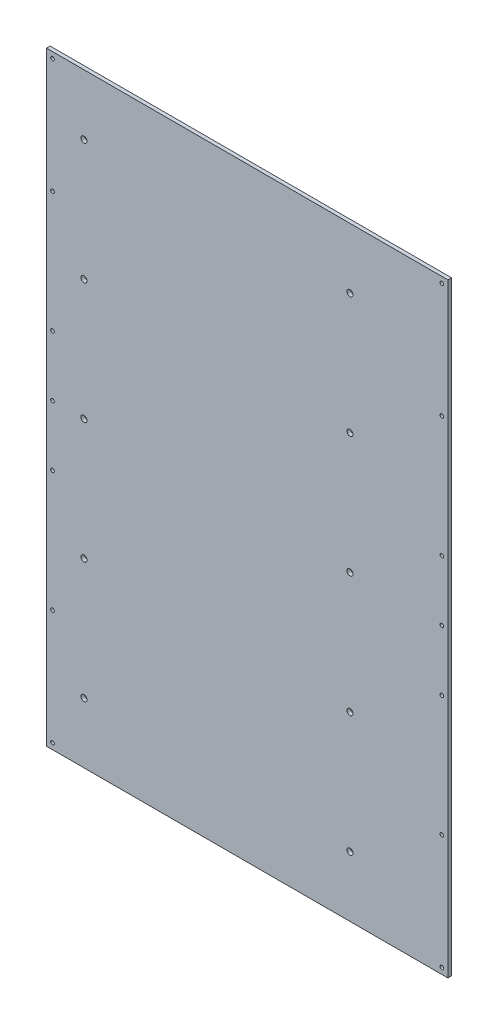
ISO-10303-21;
HEADER;
FILE_DESCRIPTION(('STEP AP214'),'2;1');
FILE_NAME('part.step','',(''),(''),'','','');
FILE_SCHEMA(('AUTOMOTIVE_DESIGN { 1 0 10303 214 1 1 1 1 }'));
ENDSEC;
DATA;
#1=APPLICATION_CONTEXT('core data for automotive mechanical design processes');
#2=APPLICATION_PROTOCOL_DEFINITION('international standard','automotive_design',2000,#1);
#3=PRODUCT_CONTEXT('',#1,'mechanical');
#4=PRODUCT('Part','Part','',(#3));
#5=PRODUCT_RELATED_PRODUCT_CATEGORY('part','',(#4));
#6=PRODUCT_DEFINITION_FORMATION('','',#4);
#7=PRODUCT_DEFINITION_CONTEXT('part definition',#1,'design');
#8=PRODUCT_DEFINITION('design','',#6,#7);
#9=PRODUCT_DEFINITION_SHAPE('','',#8);
#10=(LENGTH_UNIT() NAMED_UNIT(*) SI_UNIT(.MILLI.,.METRE.));
#11=(NAMED_UNIT(*) PLANE_ANGLE_UNIT() SI_UNIT($,.RADIAN.));
#12=(NAMED_UNIT(*) SI_UNIT($,.STERADIAN.) SOLID_ANGLE_UNIT());
#13=UNCERTAINTY_MEASURE_WITH_UNIT(LENGTH_MEASURE(1.E-05),#10,'distance_accuracy_value','');
#14=(GEOMETRIC_REPRESENTATION_CONTEXT(3) GLOBAL_UNCERTAINTY_ASSIGNED_CONTEXT((#13)) GLOBAL_UNIT_ASSIGNED_CONTEXT((#10,
#11,#12)) REPRESENTATION_CONTEXT('',''));
#15=CARTESIAN_POINT('',(0.,0.,0.));
#16=DIRECTION('',(0.,0.,1.));
#17=DIRECTION('',(1.,0.,0.));
#18=AXIS2_PLACEMENT_3D('',#15,#16,#17);
#19=CARTESIAN_POINT('',(0.,0.,3.));
#20=DIRECTION('',(0.,0.,-1.));
#21=DIRECTION('',(-1.,0.,0.));
#22=AXIS2_PLACEMENT_3D('',#19,#20,#21);
#23=PLANE('',#22);
#24=DIRECTION('',(0.,-1.,0.));
#25=VECTOR('',#24,1.);
#26=CARTESIAN_POINT('',(0.,0.,3.));
#27=LINE('',#26,#25);
#28=CARTESIAN_POINT('',(0.,500.,3.));
#29=VERTEX_POINT('',#28);
#30=CARTESIAN_POINT('',(0.,0.,3.));
#31=VERTEX_POINT('',#30);
#32=EDGE_CURVE('E87',#29,#31,#27,.T.);
#33=ORIENTED_EDGE('',*,*,#32,.T.);
#34=DIRECTION('',(1.,0.,0.));
#35=VECTOR('',#34,1.);
#36=CARTESIAN_POINT('',(0.,0.,3.));
#37=LINE('',#36,#35);
#38=CARTESIAN_POINT('',(332.,0.,3.));
#39=VERTEX_POINT('',#38);
#40=EDGE_CURVE('E82',#31,#39,#37,.T.);
#41=ORIENTED_EDGE('',*,*,#40,.T.);
#42=DIRECTION('',(0.,1.,0.));
#43=VECTOR('',#42,1.);
#44=CARTESIAN_POINT('',(332.,0.,3.));
#45=LINE('',#44,#43);
#46=CARTESIAN_POINT('',(332.,500.,3.));
#47=VERTEX_POINT('',#46);
#48=EDGE_CURVE('E85',#39,#47,#45,.T.);
#49=ORIENTED_EDGE('',*,*,#48,.T.);
#50=DIRECTION('',(-1.,0.,0.));
#51=VECTOR('',#50,1.);
#52=CARTESIAN_POINT('',(0.,500.,3.));
#53=LINE('',#52,#51);
#54=EDGE_CURVE('E52',#47,#29,#53,.T.);
#55=ORIENTED_EDGE('',*,*,#54,.T.);
#56=EDGE_LOOP('',(#33,#41,#49,#55));
#57=FACE_BOUND('',#56,.T.);
#58=CARTESIAN_POINT('',(327.,250.,3.));
#59=DIRECTION('',(0.,0.,1.));
#60=DIRECTION('',(1.,0.,0.));
#61=AXIS2_PLACEMENT_3D('',#58,#59,#60);
#62=CIRCLE('',#61,1.49999999999997);
#63=CARTESIAN_POINT('',(328.5,250.,3.));
#64=VERTEX_POINT('',#63);
#65=EDGE_CURVE('E102',#64,#64,#62,.T.);
#66=ORIENTED_EDGE('',*,*,#65,.F.);
#67=EDGE_LOOP('',(#66));
#68=FACE_BOUND('',#67,.T.);
#69=CARTESIAN_POINT('',(327.,300.,3.));
#70=DIRECTION('',(0.,0.,1.));
#71=DIRECTION('',(1.,0.,0.));
#72=AXIS2_PLACEMENT_3D('',#69,#70,#71);
#73=CIRCLE('',#72,1.49999999999997);
#74=CARTESIAN_POINT('',(328.5,300.,3.));
#75=VERTEX_POINT('',#74);
#76=EDGE_CURVE('E117',#75,#75,#73,.T.);
#77=ORIENTED_EDGE('',*,*,#76,.F.);
#78=EDGE_LOOP('',(#77));
#79=FACE_BOUND('',#78,.T.);
#80=CARTESIAN_POINT('',(327.,4.99999999999934,3.));
#81=DIRECTION('',(0.,0.,1.));
#82=DIRECTION('',(-1.,0.,0.));
#83=AXIS2_PLACEMENT_3D('',#80,#81,#82);
#84=CIRCLE('',#83,1.49999999999997);
#85=CARTESIAN_POINT('',(325.5,4.99999999999934,3.));
#86=VERTEX_POINT('',#85);
#87=EDGE_CURVE('E123',#86,#86,#84,.T.);
#88=ORIENTED_EDGE('',*,*,#87,.F.);
#89=EDGE_LOOP('',(#88));
#90=FACE_BOUND('',#89,.T.);
#91=CARTESIAN_POINT('',(327.,400.,3.));
#92=DIRECTION('',(0.,0.,1.));
#93=DIRECTION('',(1.,0.,0.));
#94=AXIS2_PLACEMENT_3D('',#91,#92,#93);
#95=CIRCLE('',#94,1.49999999999997);
#96=CARTESIAN_POINT('',(328.5,400.,3.));
#97=VERTEX_POINT('',#96);
#98=EDGE_CURVE('E129',#97,#97,#95,.T.);
#99=ORIENTED_EDGE('',*,*,#98,.F.);
#100=EDGE_LOOP('',(#99));
#101=FACE_BOUND('',#100,.T.);
#102=CARTESIAN_POINT('',(327.,99.9999999999993,3.));
#103=DIRECTION('',(0.,0.,1.));
#104=DIRECTION('',(-1.,0.,0.));
#105=AXIS2_PLACEMENT_3D('',#102,#103,#104);
#106=CIRCLE('',#105,1.49999999999997);
#107=CARTESIAN_POINT('',(325.5,99.9999999999993,3.));
#108=VERTEX_POINT('',#107);
#109=EDGE_CURVE('E135',#108,#108,#106,.T.);
#110=ORIENTED_EDGE('',*,*,#109,.F.);
#111=EDGE_LOOP('',(#110));
#112=FACE_BOUND('',#111,.T.);
#113=CARTESIAN_POINT('',(327.,495.,3.));
#114=DIRECTION('',(0.,0.,1.));
#115=DIRECTION('',(1.,0.,0.));
#116=AXIS2_PLACEMENT_3D('',#113,#114,#115);
#117=CIRCLE('',#116,1.49999999999997);
#118=CARTESIAN_POINT('',(328.5,495.,3.));
#119=VERTEX_POINT('',#118);
#120=EDGE_CURVE('E141',#119,#119,#117,.T.);
#121=ORIENTED_EDGE('',*,*,#120,.F.);
#122=EDGE_LOOP('',(#121));
#123=FACE_BOUND('',#122,.T.);
#124=CARTESIAN_POINT('',(327.,199.999999999999,3.));
#125=DIRECTION('',(0.,0.,1.));
#126=DIRECTION('',(-1.,0.,0.));
#127=AXIS2_PLACEMENT_3D('',#124,#125,#126);
#128=CIRCLE('',#127,1.49999999999996);
#129=CARTESIAN_POINT('',(325.5,199.999999999999,3.));
#130=VERTEX_POINT('',#129);
#131=EDGE_CURVE('E147',#130,#130,#128,.T.);
#132=ORIENTED_EDGE('',*,*,#131,.F.);
#133=EDGE_LOOP('',(#132));
#134=FACE_BOUND('',#133,.T.);
#135=CARTESIAN_POINT('',(5.00000000000012,199.999999999999,3.));
#136=DIRECTION('',(0.,0.,1.));
#137=DIRECTION('',(1.,0.,0.));
#138=AXIS2_PLACEMENT_3D('',#135,#136,#137);
#139=CIRCLE('',#138,1.50000000000009);
#140=CARTESIAN_POINT('',(6.5000000000002,199.999999999999,3.));
#141=VERTEX_POINT('',#140);
#142=EDGE_CURVE('E153',#141,#141,#139,.T.);
#143=ORIENTED_EDGE('',*,*,#142,.F.);
#144=EDGE_LOOP('',(#143));
#145=FACE_BOUND('',#144,.T.);
#146=CARTESIAN_POINT('',(5.00000000000006,99.9999999999993,3.));
#147=DIRECTION('',(0.,0.,1.));
#148=DIRECTION('',(1.,0.,0.));
#149=AXIS2_PLACEMENT_3D('',#146,#147,#148);
#150=CIRCLE('',#149,1.50000000000008);
#151=CARTESIAN_POINT('',(6.50000000000014,99.9999999999993,3.));
#152=VERTEX_POINT('',#151);
#153=EDGE_CURVE('E159',#152,#152,#150,.T.);
#154=ORIENTED_EDGE('',*,*,#153,.F.);
#155=EDGE_LOOP('',(#154));
#156=FACE_BOUND('',#155,.T.);
#157=CARTESIAN_POINT('',(5.00000000000006,4.9999999999993,3.));
#158=DIRECTION('',(0.,0.,1.));
#159=DIRECTION('',(1.,0.,0.));
#160=AXIS2_PLACEMENT_3D('',#157,#158,#159);
#161=CIRCLE('',#160,1.50000000000008);
#162=CARTESIAN_POINT('',(6.50000000000014,4.9999999999993,3.));
#163=VERTEX_POINT('',#162);
#164=EDGE_CURVE('E165',#163,#163,#161,.T.);
#165=ORIENTED_EDGE('',*,*,#164,.F.);
#166=EDGE_LOOP('',(#165));
#167=FACE_BOUND('',#166,.T.);
#168=CARTESIAN_POINT('',(5.,495.,3.));
#169=DIRECTION('',(0.,0.,1.));
#170=DIRECTION('',(-1.,0.,0.));
#171=AXIS2_PLACEMENT_3D('',#168,#169,#170);
#172=CIRCLE('',#171,1.50000000000007);
#173=CARTESIAN_POINT('',(3.49999999999993,495.,3.));
#174=VERTEX_POINT('',#173);
#175=EDGE_CURVE('E171',#174,#174,#172,.T.);
#176=ORIENTED_EDGE('',*,*,#175,.F.);
#177=EDGE_LOOP('',(#176));
#178=FACE_BOUND('',#177,.T.);
#179=CARTESIAN_POINT('',(5.,400.,3.));
#180=DIRECTION('',(0.,0.,1.));
#181=DIRECTION('',(-1.,0.,0.));
#182=AXIS2_PLACEMENT_3D('',#179,#180,#181);
#183=CIRCLE('',#182,1.50000000000007);
#184=CARTESIAN_POINT('',(3.49999999999993,400.,3.));
#185=VERTEX_POINT('',#184);
#186=EDGE_CURVE('E177',#185,#185,#183,.T.);
#187=ORIENTED_EDGE('',*,*,#186,.F.);
#188=EDGE_LOOP('',(#187));
#189=FACE_BOUND('',#188,.T.);
#190=CARTESIAN_POINT('',(5.00000000000012,300.,3.));
#191=DIRECTION('',(0.,0.,1.));
#192=DIRECTION('',(-1.,0.,0.));
#193=AXIS2_PLACEMENT_3D('',#190,#191,#192);
#194=CIRCLE('',#193,1.50000000000007);
#195=CARTESIAN_POINT('',(3.50000000000004,300.,3.));
#196=VERTEX_POINT('',#195);
#197=EDGE_CURVE('E183',#196,#196,#194,.T.);
#198=ORIENTED_EDGE('',*,*,#197,.F.);
#199=EDGE_LOOP('',(#198));
#200=FACE_BOUND('',#199,.T.);
#201=CARTESIAN_POINT('',(5.,250.,3.));
#202=DIRECTION('',(0.,0.,1.));
#203=DIRECTION('',(-1.,0.,0.));
#204=AXIS2_PLACEMENT_3D('',#201,#202,#203);
#205=CIRCLE('',#204,1.50000000000008);
#206=CARTESIAN_POINT('',(3.49999999999993,250.,3.));
#207=VERTEX_POINT('',#206);
#208=EDGE_CURVE('E189',#207,#207,#205,.T.);
#209=ORIENTED_EDGE('',*,*,#208,.F.);
#210=EDGE_LOOP('',(#209));
#211=FACE_BOUND('',#210,.T.);
#212=CARTESIAN_POINT('',(251.000000000002,250.,3.));
#213=DIRECTION('',(0.,0.,1.));
#214=DIRECTION('',(1.,0.,0.));
#215=AXIS2_PLACEMENT_3D('',#212,#213,#214);
#216=CIRCLE('',#215,2.50000000000002);
#217=CARTESIAN_POINT('',(253.500000000002,250.,3.));
#218=VERTEX_POINT('',#217);
#219=EDGE_CURVE('E195',#218,#218,#216,.T.);
#220=ORIENTED_EDGE('',*,*,#219,.F.);
#221=EDGE_LOOP('',(#220));
#222=FACE_BOUND('',#221,.T.);
#223=CARTESIAN_POINT('',(251.,150.,3.));
#224=DIRECTION('',(0.,0.,1.));
#225=DIRECTION('',(1.,0.,0.));
#226=AXIS2_PLACEMENT_3D('',#223,#224,#225);
#227=CIRCLE('',#226,2.50000000000002);
#228=CARTESIAN_POINT('',(253.5,150.,3.));
#229=VERTEX_POINT('',#228);
#230=EDGE_CURVE('E201',#229,#229,#227,.T.);
#231=ORIENTED_EDGE('',*,*,#230,.F.);
#232=EDGE_LOOP('',(#231));
#233=FACE_BOUND('',#232,.T.);
#234=CARTESIAN_POINT('',(251.,49.9999999999998,3.));
#235=DIRECTION('',(0.,0.,1.));
#236=DIRECTION('',(1.,0.,0.));
#237=AXIS2_PLACEMENT_3D('',#234,#235,#236);
#238=CIRCLE('',#237,2.50000000000002);
#239=CARTESIAN_POINT('',(253.5,49.9999999999998,3.));
#240=VERTEX_POINT('',#239);
#241=EDGE_CURVE('E207',#240,#240,#238,.T.);
#242=ORIENTED_EDGE('',*,*,#241,.F.);
#243=EDGE_LOOP('',(#242));
#244=FACE_BOUND('',#243,.T.);
#245=CARTESIAN_POINT('',(251.,350.,3.));
#246=DIRECTION('',(0.,0.,1.));
#247=DIRECTION('',(1.,0.,0.));
#248=AXIS2_PLACEMENT_3D('',#245,#246,#247);
#249=CIRCLE('',#248,2.50000000000002);
#250=CARTESIAN_POINT('',(253.5,350.,3.));
#251=VERTEX_POINT('',#250);
#252=EDGE_CURVE('E213',#251,#251,#249,.T.);
#253=ORIENTED_EDGE('',*,*,#252,.F.);
#254=EDGE_LOOP('',(#253));
#255=FACE_BOUND('',#254,.T.);
#256=CARTESIAN_POINT('',(251.,450.,3.));
#257=DIRECTION('',(0.,0.,1.));
#258=DIRECTION('',(1.,0.,0.));
#259=AXIS2_PLACEMENT_3D('',#256,#257,#258);
#260=CIRCLE('',#259,2.50000000000002);
#261=CARTESIAN_POINT('',(253.5,450.,3.));
#262=VERTEX_POINT('',#261);
#263=EDGE_CURVE('E219',#262,#262,#260,.T.);
#264=ORIENTED_EDGE('',*,*,#263,.F.);
#265=EDGE_LOOP('',(#264));
#266=FACE_BOUND('',#265,.T.);
#267=CARTESIAN_POINT('',(30.9999999999745,250.000000000028,3.));
#268=DIRECTION('',(0.,0.,1.));
#269=DIRECTION('',(1.,0.,0.));
#270=AXIS2_PLACEMENT_3D('',#267,#268,#269);
#271=CIRCLE('',#270,2.50000000000002);
#272=CARTESIAN_POINT('',(33.4999999999746,250.000000000028,3.));
#273=VERTEX_POINT('',#272);
#274=EDGE_CURVE('E225',#273,#273,#271,.T.);
#275=ORIENTED_EDGE('',*,*,#274,.F.);
#276=EDGE_LOOP('',(#275));
#277=FACE_BOUND('',#276,.T.);
#278=CARTESIAN_POINT('',(30.9999999999722,150.000000000028,3.));
#279=DIRECTION('',(0.,0.,1.));
#280=DIRECTION('',(1.,0.,0.));
#281=AXIS2_PLACEMENT_3D('',#278,#279,#280);
#282=CIRCLE('',#281,2.50000000000002);
#283=CARTESIAN_POINT('',(33.4999999999722,150.000000000028,3.));
#284=VERTEX_POINT('',#283);
#285=EDGE_CURVE('E231',#284,#284,#282,.T.);
#286=ORIENTED_EDGE('',*,*,#285,.F.);
#287=EDGE_LOOP('',(#286));
#288=FACE_BOUND('',#287,.T.);
#289=CARTESIAN_POINT('',(30.9999999999722,50.0000000000282,3.));
#290=DIRECTION('',(0.,0.,1.));
#291=DIRECTION('',(1.,0.,0.));
#292=AXIS2_PLACEMENT_3D('',#289,#290,#291);
#293=CIRCLE('',#292,2.50000000000002);
#294=CARTESIAN_POINT('',(33.4999999999722,50.0000000000282,3.));
#295=VERTEX_POINT('',#294);
#296=EDGE_CURVE('E237',#295,#295,#293,.T.);
#297=ORIENTED_EDGE('',*,*,#296,.F.);
#298=EDGE_LOOP('',(#297));
#299=FACE_BOUND('',#298,.T.);
#300=CARTESIAN_POINT('',(30.9999999999722,350.000000000028,3.));
#301=DIRECTION('',(0.,0.,1.));
#302=DIRECTION('',(1.,0.,0.));
#303=AXIS2_PLACEMENT_3D('',#300,#301,#302);
#304=CIRCLE('',#303,2.50000000000002);
#305=CARTESIAN_POINT('',(33.4999999999722,350.000000000028,3.));
#306=VERTEX_POINT('',#305);
#307=EDGE_CURVE('E243',#306,#306,#304,.T.);
#308=ORIENTED_EDGE('',*,*,#307,.F.);
#309=EDGE_LOOP('',(#308));
#310=FACE_BOUND('',#309,.T.);
#311=CARTESIAN_POINT('',(30.9999999999722,450.000000000028,3.));
#312=DIRECTION('',(0.,0.,1.));
#313=DIRECTION('',(1.,0.,0.));
#314=AXIS2_PLACEMENT_3D('',#311,#312,#313);
#315=CIRCLE('',#314,2.50000000000002);
#316=CARTESIAN_POINT('',(33.4999999999722,450.000000000028,3.));
#317=VERTEX_POINT('',#316);
#318=EDGE_CURVE('E249',#317,#317,#315,.T.);
#319=ORIENTED_EDGE('',*,*,#318,.F.);
#320=EDGE_LOOP('',(#319));
#321=FACE_BOUND('',#320,.T.);
#322=ADVANCED_FACE('F35',(#57,#68,#79,#90,#101,#112,#123,#134,#145,#156,#167,#178,#189,#200,
#211,#222,#233,#244,#255,#266,#277,#288,#299,#310,#321),#23,.F.);
#323=CARTESIAN_POINT('',(0.,0.,0.));
#324=DIRECTION('',(0.,0.,-1.));
#325=DIRECTION('',(-1.,0.,0.));
#326=AXIS2_PLACEMENT_3D('',#323,#324,#325);
#327=PLANE('',#326);
#328=CARTESIAN_POINT('',(30.9999999999722,350.000000000028,0.));
#329=DIRECTION('',(0.,0.,1.));
#330=DIRECTION('',(1.,0.,0.));
#331=AXIS2_PLACEMENT_3D('',#328,#329,#330);
#332=CIRCLE('',#331,2.50000000000002);
#333=CARTESIAN_POINT('',(33.4999999999722,350.000000000028,0.));
#334=VERTEX_POINT('',#333);
#335=EDGE_CURVE('E246',#334,#334,#332,.T.);
#336=ORIENTED_EDGE('',*,*,#335,.T.);
#337=EDGE_LOOP('',(#336));
#338=FACE_BOUND('',#337,.T.);
#339=CARTESIAN_POINT('',(30.9999999999722,150.000000000028,0.));
#340=DIRECTION('',(0.,0.,1.));
#341=DIRECTION('',(1.,0.,0.));
#342=AXIS2_PLACEMENT_3D('',#339,#340,#341);
#343=CIRCLE('',#342,2.50000000000002);
#344=CARTESIAN_POINT('',(33.4999999999722,150.000000000028,0.));
#345=VERTEX_POINT('',#344);
#346=EDGE_CURVE('E234',#345,#345,#343,.T.);
#347=ORIENTED_EDGE('',*,*,#346,.T.);
#348=EDGE_LOOP('',(#347));
#349=FACE_BOUND('',#348,.T.);
#350=CARTESIAN_POINT('',(251.,450.,0.));
#351=DIRECTION('',(0.,0.,1.));
#352=DIRECTION('',(1.,0.,0.));
#353=AXIS2_PLACEMENT_3D('',#350,#351,#352);
#354=CIRCLE('',#353,2.50000000000002);
#355=CARTESIAN_POINT('',(253.5,450.,0.));
#356=VERTEX_POINT('',#355);
#357=EDGE_CURVE('E222',#356,#356,#354,.T.);
#358=ORIENTED_EDGE('',*,*,#357,.T.);
#359=EDGE_LOOP('',(#358));
#360=FACE_BOUND('',#359,.T.);
#361=CARTESIAN_POINT('',(251.,49.9999999999998,0.));
#362=DIRECTION('',(0.,0.,1.));
#363=DIRECTION('',(1.,0.,0.));
#364=AXIS2_PLACEMENT_3D('',#361,#362,#363);
#365=CIRCLE('',#364,2.50000000000002);
#366=CARTESIAN_POINT('',(253.5,49.9999999999998,0.));
#367=VERTEX_POINT('',#366);
#368=EDGE_CURVE('E210',#367,#367,#365,.T.);
#369=ORIENTED_EDGE('',*,*,#368,.T.);
#370=EDGE_LOOP('',(#369));
#371=FACE_BOUND('',#370,.T.);
#372=CARTESIAN_POINT('',(251.000000000002,250.,0.));
#373=DIRECTION('',(0.,0.,1.));
#374=DIRECTION('',(1.,0.,0.));
#375=AXIS2_PLACEMENT_3D('',#372,#373,#374);
#376=CIRCLE('',#375,2.50000000000002);
#377=CARTESIAN_POINT('',(253.500000000002,250.,0.));
#378=VERTEX_POINT('',#377);
#379=EDGE_CURVE('E198',#378,#378,#376,.T.);
#380=ORIENTED_EDGE('',*,*,#379,.T.);
#381=EDGE_LOOP('',(#380));
#382=FACE_BOUND('',#381,.T.);
#383=CARTESIAN_POINT('',(5.00000000000012,300.,0.));
#384=DIRECTION('',(0.,0.,1.));
#385=DIRECTION('',(-1.,0.,0.));
#386=AXIS2_PLACEMENT_3D('',#383,#384,#385);
#387=CIRCLE('',#386,1.50000000000007);
#388=CARTESIAN_POINT('',(3.50000000000004,300.,0.));
#389=VERTEX_POINT('',#388);
#390=EDGE_CURVE('E186',#389,#389,#387,.T.);
#391=ORIENTED_EDGE('',*,*,#390,.T.);
#392=EDGE_LOOP('',(#391));
#393=FACE_BOUND('',#392,.T.);
#394=CARTESIAN_POINT('',(5.,495.,0.));
#395=DIRECTION('',(0.,0.,1.));
#396=DIRECTION('',(-1.,0.,0.));
#397=AXIS2_PLACEMENT_3D('',#394,#395,#396);
#398=CIRCLE('',#397,1.50000000000007);
#399=CARTESIAN_POINT('',(3.49999999999993,495.,0.));
#400=VERTEX_POINT('',#399);
#401=EDGE_CURVE('E174',#400,#400,#398,.T.);
#402=ORIENTED_EDGE('',*,*,#401,.T.);
#403=EDGE_LOOP('',(#402));
#404=FACE_BOUND('',#403,.T.);
#405=CARTESIAN_POINT('',(5.00000000000006,99.9999999999993,0.));
#406=DIRECTION('',(0.,0.,1.));
#407=DIRECTION('',(1.,0.,0.));
#408=AXIS2_PLACEMENT_3D('',#405,#406,#407);
#409=CIRCLE('',#408,1.50000000000008);
#410=CARTESIAN_POINT('',(6.50000000000014,99.9999999999993,0.));
#411=VERTEX_POINT('',#410);
#412=EDGE_CURVE('E162',#411,#411,#409,.T.);
#413=ORIENTED_EDGE('',*,*,#412,.T.);
#414=EDGE_LOOP('',(#413));
#415=FACE_BOUND('',#414,.T.);
#416=CARTESIAN_POINT('',(327.,199.999999999999,0.));
#417=DIRECTION('',(0.,0.,1.));
#418=DIRECTION('',(-1.,0.,0.));
#419=AXIS2_PLACEMENT_3D('',#416,#417,#418);
#420=CIRCLE('',#419,1.49999999999996);
#421=CARTESIAN_POINT('',(325.5,199.999999999999,0.));
#422=VERTEX_POINT('',#421);
#423=EDGE_CURVE('E150',#422,#422,#420,.T.);
#424=ORIENTED_EDGE('',*,*,#423,.T.);
#425=EDGE_LOOP('',(#424));
#426=FACE_BOUND('',#425,.T.);
#427=CARTESIAN_POINT('',(327.,99.9999999999993,0.));
#428=DIRECTION('',(0.,0.,1.));
#429=DIRECTION('',(-1.,0.,0.));
#430=AXIS2_PLACEMENT_3D('',#427,#428,#429);
#431=CIRCLE('',#430,1.49999999999997);
#432=CARTESIAN_POINT('',(325.5,99.9999999999993,0.));
#433=VERTEX_POINT('',#432);
#434=EDGE_CURVE('E138',#433,#433,#431,.T.);
#435=ORIENTED_EDGE('',*,*,#434,.T.);
#436=EDGE_LOOP('',(#435));
#437=FACE_BOUND('',#436,.T.);
#438=CARTESIAN_POINT('',(327.,4.99999999999934,0.));
#439=DIRECTION('',(0.,0.,1.));
#440=DIRECTION('',(-1.,0.,0.));
#441=AXIS2_PLACEMENT_3D('',#438,#439,#440);
#442=CIRCLE('',#441,1.49999999999997);
#443=CARTESIAN_POINT('',(325.5,4.99999999999934,0.));
#444=VERTEX_POINT('',#443);
#445=EDGE_CURVE('E126',#444,#444,#442,.T.);
#446=ORIENTED_EDGE('',*,*,#445,.T.);
#447=EDGE_LOOP('',(#446));
#448=FACE_BOUND('',#447,.T.);
#449=CARTESIAN_POINT('',(327.,250.,0.));
#450=DIRECTION('',(0.,0.,1.));
#451=DIRECTION('',(1.,0.,0.));
#452=AXIS2_PLACEMENT_3D('',#449,#450,#451);
#453=CIRCLE('',#452,1.49999999999997);
#454=CARTESIAN_POINT('',(328.5,250.,0.));
#455=VERTEX_POINT('',#454);
#456=EDGE_CURVE('E114',#455,#455,#453,.T.);
#457=ORIENTED_EDGE('',*,*,#456,.T.);
#458=EDGE_LOOP('',(#457));
#459=FACE_BOUND('',#458,.T.);
#460=DIRECTION('',(0.,-1.,0.));
#461=VECTOR('',#460,1.);
#462=CARTESIAN_POINT('',(0.,0.,0.));
#463=LINE('',#462,#461);
#464=CARTESIAN_POINT('',(0.,500.,0.));
#465=VERTEX_POINT('',#464);
#466=CARTESIAN_POINT('',(0.,0.,0.));
#467=VERTEX_POINT('',#466);
#468=EDGE_CURVE('E99',#465,#467,#463,.T.);
#469=ORIENTED_EDGE('',*,*,#468,.F.);
#470=DIRECTION('',(-1.,0.,0.));
#471=VECTOR('',#470,1.);
#472=CARTESIAN_POINT('',(0.,500.,0.));
#473=LINE('',#472,#471);
#474=CARTESIAN_POINT('',(332.,500.,0.));
#475=VERTEX_POINT('',#474);
#476=EDGE_CURVE('E75',#475,#465,#473,.T.);
#477=ORIENTED_EDGE('',*,*,#476,.F.);
#478=DIRECTION('',(0.,1.,0.));
#479=VECTOR('',#478,1.);
#480=CARTESIAN_POINT('',(332.,0.,0.));
#481=LINE('',#480,#479);
#482=CARTESIAN_POINT('',(332.,0.,0.));
#483=VERTEX_POINT('',#482);
#484=EDGE_CURVE('E69',#483,#475,#481,.T.);
#485=ORIENTED_EDGE('',*,*,#484,.F.);
#486=DIRECTION('',(1.,0.,0.));
#487=VECTOR('',#486,1.);
#488=CARTESIAN_POINT('',(0.,0.,0.));
#489=LINE('',#488,#487);
#490=EDGE_CURVE('E91',#467,#483,#489,.T.);
#491=ORIENTED_EDGE('',*,*,#490,.F.);
#492=EDGE_LOOP('',(#469,#477,#485,#491));
#493=FACE_BOUND('',#492,.T.);
#494=CARTESIAN_POINT('',(327.,300.,0.));
#495=DIRECTION('',(0.,0.,1.));
#496=DIRECTION('',(1.,0.,0.));
#497=AXIS2_PLACEMENT_3D('',#494,#495,#496);
#498=CIRCLE('',#497,1.49999999999997);
#499=CARTESIAN_POINT('',(328.5,300.,0.));
#500=VERTEX_POINT('',#499);
#501=EDGE_CURVE('E120',#500,#500,#498,.T.);
#502=ORIENTED_EDGE('',*,*,#501,.T.);
#503=EDGE_LOOP('',(#502));
#504=FACE_BOUND('',#503,.T.);
#505=CARTESIAN_POINT('',(327.,400.,0.));
#506=DIRECTION('',(0.,0.,1.));
#507=DIRECTION('',(1.,0.,0.));
#508=AXIS2_PLACEMENT_3D('',#505,#506,#507);
#509=CIRCLE('',#508,1.49999999999997);
#510=CARTESIAN_POINT('',(328.5,400.,0.));
#511=VERTEX_POINT('',#510);
#512=EDGE_CURVE('E132',#511,#511,#509,.T.);
#513=ORIENTED_EDGE('',*,*,#512,.T.);
#514=EDGE_LOOP('',(#513));
#515=FACE_BOUND('',#514,.T.);
#516=CARTESIAN_POINT('',(327.,495.,0.));
#517=DIRECTION('',(0.,0.,1.));
#518=DIRECTION('',(1.,0.,0.));
#519=AXIS2_PLACEMENT_3D('',#516,#517,#518);
#520=CIRCLE('',#519,1.49999999999997);
#521=CARTESIAN_POINT('',(328.5,495.,0.));
#522=VERTEX_POINT('',#521);
#523=EDGE_CURVE('E144',#522,#522,#520,.T.);
#524=ORIENTED_EDGE('',*,*,#523,.T.);
#525=EDGE_LOOP('',(#524));
#526=FACE_BOUND('',#525,.T.);
#527=CARTESIAN_POINT('',(5.00000000000012,199.999999999999,0.));
#528=DIRECTION('',(0.,0.,1.));
#529=DIRECTION('',(1.,0.,0.));
#530=AXIS2_PLACEMENT_3D('',#527,#528,#529);
#531=CIRCLE('',#530,1.50000000000009);
#532=CARTESIAN_POINT('',(6.5000000000002,199.999999999999,0.));
#533=VERTEX_POINT('',#532);
#534=EDGE_CURVE('E156',#533,#533,#531,.T.);
#535=ORIENTED_EDGE('',*,*,#534,.T.);
#536=EDGE_LOOP('',(#535));
#537=FACE_BOUND('',#536,.T.);
#538=CARTESIAN_POINT('',(5.00000000000006,4.9999999999993,0.));
#539=DIRECTION('',(0.,0.,1.));
#540=DIRECTION('',(1.,0.,0.));
#541=AXIS2_PLACEMENT_3D('',#538,#539,#540);
#542=CIRCLE('',#541,1.50000000000008);
#543=CARTESIAN_POINT('',(6.50000000000014,4.9999999999993,0.));
#544=VERTEX_POINT('',#543);
#545=EDGE_CURVE('E168',#544,#544,#542,.T.);
#546=ORIENTED_EDGE('',*,*,#545,.T.);
#547=EDGE_LOOP('',(#546));
#548=FACE_BOUND('',#547,.T.);
#549=CARTESIAN_POINT('',(5.,400.,0.));
#550=DIRECTION('',(0.,0.,1.));
#551=DIRECTION('',(-1.,0.,0.));
#552=AXIS2_PLACEMENT_3D('',#549,#550,#551);
#553=CIRCLE('',#552,1.50000000000007);
#554=CARTESIAN_POINT('',(3.49999999999993,400.,0.));
#555=VERTEX_POINT('',#554);
#556=EDGE_CURVE('E180',#555,#555,#553,.T.);
#557=ORIENTED_EDGE('',*,*,#556,.T.);
#558=EDGE_LOOP('',(#557));
#559=FACE_BOUND('',#558,.T.);
#560=CARTESIAN_POINT('',(5.,250.,0.));
#561=DIRECTION('',(0.,0.,1.));
#562=DIRECTION('',(-1.,0.,0.));
#563=AXIS2_PLACEMENT_3D('',#560,#561,#562);
#564=CIRCLE('',#563,1.50000000000008);
#565=CARTESIAN_POINT('',(3.49999999999993,250.,0.));
#566=VERTEX_POINT('',#565);
#567=EDGE_CURVE('E192',#566,#566,#564,.T.);
#568=ORIENTED_EDGE('',*,*,#567,.T.);
#569=EDGE_LOOP('',(#568));
#570=FACE_BOUND('',#569,.T.);
#571=CARTESIAN_POINT('',(251.,150.,0.));
#572=DIRECTION('',(0.,0.,1.));
#573=DIRECTION('',(1.,0.,0.));
#574=AXIS2_PLACEMENT_3D('',#571,#572,#573);
#575=CIRCLE('',#574,2.50000000000002);
#576=CARTESIAN_POINT('',(253.5,150.,0.));
#577=VERTEX_POINT('',#576);
#578=EDGE_CURVE('E204',#577,#577,#575,.T.);
#579=ORIENTED_EDGE('',*,*,#578,.T.);
#580=EDGE_LOOP('',(#579));
#581=FACE_BOUND('',#580,.T.);
#582=CARTESIAN_POINT('',(251.,350.,0.));
#583=DIRECTION('',(0.,0.,1.));
#584=DIRECTION('',(1.,0.,0.));
#585=AXIS2_PLACEMENT_3D('',#582,#583,#584);
#586=CIRCLE('',#585,2.50000000000002);
#587=CARTESIAN_POINT('',(253.5,350.,0.));
#588=VERTEX_POINT('',#587);
#589=EDGE_CURVE('E216',#588,#588,#586,.T.);
#590=ORIENTED_EDGE('',*,*,#589,.T.);
#591=EDGE_LOOP('',(#590));
#592=FACE_BOUND('',#591,.T.);
#593=CARTESIAN_POINT('',(30.9999999999745,250.000000000028,0.));
#594=DIRECTION('',(0.,0.,1.));
#595=DIRECTION('',(1.,0.,0.));
#596=AXIS2_PLACEMENT_3D('',#593,#594,#595);
#597=CIRCLE('',#596,2.50000000000002);
#598=CARTESIAN_POINT('',(33.4999999999746,250.000000000028,0.));
#599=VERTEX_POINT('',#598);
#600=EDGE_CURVE('E228',#599,#599,#597,.T.);
#601=ORIENTED_EDGE('',*,*,#600,.T.);
#602=EDGE_LOOP('',(#601));
#603=FACE_BOUND('',#602,.T.);
#604=CARTESIAN_POINT('',(30.9999999999722,50.0000000000282,0.));
#605=DIRECTION('',(0.,0.,1.));
#606=DIRECTION('',(1.,0.,0.));
#607=AXIS2_PLACEMENT_3D('',#604,#605,#606);
#608=CIRCLE('',#607,2.50000000000002);
#609=CARTESIAN_POINT('',(33.4999999999722,50.0000000000282,0.));
#610=VERTEX_POINT('',#609);
#611=EDGE_CURVE('E240',#610,#610,#608,.T.);
#612=ORIENTED_EDGE('',*,*,#611,.T.);
#613=EDGE_LOOP('',(#612));
#614=FACE_BOUND('',#613,.T.);
#615=CARTESIAN_POINT('',(30.9999999999722,450.000000000028,0.));
#616=DIRECTION('',(0.,0.,1.));
#617=DIRECTION('',(1.,0.,0.));
#618=AXIS2_PLACEMENT_3D('',#615,#616,#617);
#619=CIRCLE('',#618,2.50000000000002);
#620=CARTESIAN_POINT('',(33.4999999999722,450.000000000028,0.));
#621=VERTEX_POINT('',#620);
#622=EDGE_CURVE('E252',#621,#621,#619,.T.);
#623=ORIENTED_EDGE('',*,*,#622,.T.);
#624=EDGE_LOOP('',(#623));
#625=FACE_BOUND('',#624,.T.);
#626=ADVANCED_FACE('F110',(#338,#349,#360,#371,#382,#393,#404,#415,#426,#437,#448,#459,#493,
#504,#515,#526,#537,#548,#559,#570,#581,#592,#603,#614,#625),#327,.T.);
#627=CARTESIAN_POINT('',(0.,0.,3.));
#628=DIRECTION('',(1.,0.,0.));
#629=DIRECTION('',(0.,0.,-1.));
#630=AXIS2_PLACEMENT_3D('',#627,#628,#629);
#631=PLANE('',#630);
#632=ORIENTED_EDGE('',*,*,#468,.T.);
#633=DIRECTION('',(0.,0.,-1.));
#634=VECTOR('',#633,1.);
#635=CARTESIAN_POINT('',(0.,0.,3.));
#636=LINE('',#635,#634);
#637=EDGE_CURVE('E11',#31,#467,#636,.T.);
#638=ORIENTED_EDGE('',*,*,#637,.F.);
#639=ORIENTED_EDGE('',*,*,#32,.F.);
#640=DIRECTION('',(0.,0.,-1.));
#641=VECTOR('',#640,1.);
#642=CARTESIAN_POINT('',(0.,500.,3.));
#643=LINE('',#642,#641);
#644=EDGE_CURVE('E95',#29,#465,#643,.T.);
#645=ORIENTED_EDGE('',*,*,#644,.T.);
#646=EDGE_LOOP('',(#632,#638,#639,#645));
#647=FACE_BOUND('',#646,.T.);
#648=ADVANCED_FACE('F37',(#647),#631,.F.);
#649=CARTESIAN_POINT('',(0.,0.,3.));
#650=DIRECTION('',(0.,1.,0.));
#651=DIRECTION('',(0.,0.,1.));
#652=AXIS2_PLACEMENT_3D('',#649,#650,#651);
#653=PLANE('',#652);
#654=ORIENTED_EDGE('',*,*,#490,.T.);
#655=DIRECTION('',(0.,0.,-1.));
#656=VECTOR('',#655,1.);
#657=CARTESIAN_POINT('',(332.,0.,3.));
#658=LINE('',#657,#656);
#659=EDGE_CURVE('E44',#39,#483,#658,.T.);
#660=ORIENTED_EDGE('',*,*,#659,.F.);
#661=ORIENTED_EDGE('',*,*,#40,.F.);
#662=ORIENTED_EDGE('',*,*,#637,.T.);
#663=EDGE_LOOP('',(#654,#660,#661,#662));
#664=FACE_BOUND('',#663,.T.);
#665=ADVANCED_FACE('F90',(#664),#653,.F.);
#666=CARTESIAN_POINT('',(332.,0.,3.));
#667=DIRECTION('',(-1.,0.,0.));
#668=DIRECTION('',(0.,0.,1.));
#669=AXIS2_PLACEMENT_3D('',#666,#667,#668);
#670=PLANE('',#669);
#671=ORIENTED_EDGE('',*,*,#484,.T.);
#672=DIRECTION('',(0.,0.,-1.));
#673=VECTOR('',#672,1.);
#674=CARTESIAN_POINT('',(332.,500.,3.));
#675=LINE('',#674,#673);
#676=EDGE_CURVE('E92',#47,#475,#675,.T.);
#677=ORIENTED_EDGE('',*,*,#676,.F.);
#678=ORIENTED_EDGE('',*,*,#48,.F.);
#679=ORIENTED_EDGE('',*,*,#659,.T.);
#680=EDGE_LOOP('',(#671,#677,#678,#679));
#681=FACE_BOUND('',#680,.T.);
#682=ADVANCED_FACE('F93',(#681),#670,.F.);
#683=CARTESIAN_POINT('',(0.,500.,3.));
#684=DIRECTION('',(0.,-1.,0.));
#685=DIRECTION('',(0.,0.,-1.));
#686=AXIS2_PLACEMENT_3D('',#683,#684,#685);
#687=PLANE('',#686);
#688=ORIENTED_EDGE('',*,*,#476,.T.);
#689=ORIENTED_EDGE('',*,*,#644,.F.);
#690=ORIENTED_EDGE('',*,*,#54,.F.);
#691=ORIENTED_EDGE('',*,*,#676,.T.);
#692=EDGE_LOOP('',(#688,#689,#690,#691));
#693=FACE_BOUND('',#692,.T.);
#694=ADVANCED_FACE('F107',(#693),#687,.F.);
#695=CARTESIAN_POINT('',(327.,250.,3.));
#696=DIRECTION('',(0.,0.,-1.));
#697=DIRECTION('',(-1.,0.,0.));
#698=AXIS2_PLACEMENT_3D('',#695,#696,#697);
#699=CYLINDRICAL_SURFACE('',#698,1.49999999999997);
#700=ORIENTED_EDGE('',*,*,#65,.T.);
#701=EDGE_LOOP('',(#700));
#702=FACE_BOUND('',#701,.T.);
#703=ORIENTED_EDGE('',*,*,#456,.F.);
#704=EDGE_LOOP('',(#703));
#705=FACE_BOUND('',#704,.T.);
#706=ADVANCED_FACE('F269',(#702,#705),#699,.F.);
#707=CARTESIAN_POINT('',(327.,300.,3.));
#708=DIRECTION('',(0.,0.,-1.));
#709=DIRECTION('',(-1.,0.,0.));
#710=AXIS2_PLACEMENT_3D('',#707,#708,#709);
#711=CYLINDRICAL_SURFACE('',#710,1.49999999999997);
#712=ORIENTED_EDGE('',*,*,#76,.T.);
#713=EDGE_LOOP('',(#712));
#714=FACE_BOUND('',#713,.T.);
#715=ORIENTED_EDGE('',*,*,#501,.F.);
#716=EDGE_LOOP('',(#715));
#717=FACE_BOUND('',#716,.T.);
#718=ADVANCED_FACE('F315',(#714,#717),#711,.F.);
#719=CARTESIAN_POINT('',(327.,4.99999999999934,3.));
#720=DIRECTION('',(0.,0.,-1.));
#721=DIRECTION('',(-1.,0.,0.));
#722=AXIS2_PLACEMENT_3D('',#719,#720,#721);
#723=CYLINDRICAL_SURFACE('',#722,1.49999999999997);
#724=ORIENTED_EDGE('',*,*,#87,.T.);
#725=EDGE_LOOP('',(#724));
#726=FACE_BOUND('',#725,.T.);
#727=ORIENTED_EDGE('',*,*,#445,.F.);
#728=EDGE_LOOP('',(#727));
#729=FACE_BOUND('',#728,.T.);
#730=ADVANCED_FACE('F323',(#726,#729),#723,.F.);
#731=CARTESIAN_POINT('',(327.,400.,3.));
#732=DIRECTION('',(0.,0.,-1.));
#733=DIRECTION('',(-1.,0.,0.));
#734=AXIS2_PLACEMENT_3D('',#731,#732,#733);
#735=CYLINDRICAL_SURFACE('',#734,1.49999999999997);
#736=ORIENTED_EDGE('',*,*,#98,.T.);
#737=EDGE_LOOP('',(#736));
#738=FACE_BOUND('',#737,.T.);
#739=ORIENTED_EDGE('',*,*,#512,.F.);
#740=EDGE_LOOP('',(#739));
#741=FACE_BOUND('',#740,.T.);
#742=ADVANCED_FACE('F331',(#738,#741),#735,.F.);
#743=CARTESIAN_POINT('',(327.,99.9999999999993,3.));
#744=DIRECTION('',(0.,0.,-1.));
#745=DIRECTION('',(-1.,0.,0.));
#746=AXIS2_PLACEMENT_3D('',#743,#744,#745);
#747=CYLINDRICAL_SURFACE('',#746,1.49999999999997);
#748=ORIENTED_EDGE('',*,*,#109,.T.);
#749=EDGE_LOOP('',(#748));
#750=FACE_BOUND('',#749,.T.);
#751=ORIENTED_EDGE('',*,*,#434,.F.);
#752=EDGE_LOOP('',(#751));
#753=FACE_BOUND('',#752,.T.);
#754=ADVANCED_FACE('F340',(#750,#753),#747,.F.);
#755=CARTESIAN_POINT('',(327.,495.,3.));
#756=DIRECTION('',(0.,0.,-1.));
#757=DIRECTION('',(-1.,0.,0.));
#758=AXIS2_PLACEMENT_3D('',#755,#756,#757);
#759=CYLINDRICAL_SURFACE('',#758,1.49999999999997);
#760=ORIENTED_EDGE('',*,*,#120,.T.);
#761=EDGE_LOOP('',(#760));
#762=FACE_BOUND('',#761,.T.);
#763=ORIENTED_EDGE('',*,*,#523,.F.);
#764=EDGE_LOOP('',(#763));
#765=FACE_BOUND('',#764,.T.);
#766=ADVANCED_FACE('F349',(#762,#765),#759,.F.);
#767=CARTESIAN_POINT('',(327.,199.999999999999,3.));
#768=DIRECTION('',(0.,0.,-1.));
#769=DIRECTION('',(-1.,0.,0.));
#770=AXIS2_PLACEMENT_3D('',#767,#768,#769);
#771=CYLINDRICAL_SURFACE('',#770,1.49999999999996);
#772=ORIENTED_EDGE('',*,*,#131,.T.);
#773=EDGE_LOOP('',(#772));
#774=FACE_BOUND('',#773,.T.);
#775=ORIENTED_EDGE('',*,*,#423,.F.);
#776=EDGE_LOOP('',(#775));
#777=FACE_BOUND('',#776,.T.);
#778=ADVANCED_FACE('F358',(#774,#777),#771,.F.);
#779=CARTESIAN_POINT('',(5.00000000000012,199.999999999999,3.));
#780=DIRECTION('',(0.,0.,-1.));
#781=DIRECTION('',(-1.,0.,0.));
#782=AXIS2_PLACEMENT_3D('',#779,#780,#781);
#783=CYLINDRICAL_SURFACE('',#782,1.50000000000009);
#784=ORIENTED_EDGE('',*,*,#142,.T.);
#785=EDGE_LOOP('',(#784));
#786=FACE_BOUND('',#785,.T.);
#787=ORIENTED_EDGE('',*,*,#534,.F.);
#788=EDGE_LOOP('',(#787));
#789=FACE_BOUND('',#788,.T.);
#790=ADVANCED_FACE('F367',(#786,#789),#783,.F.);
#791=CARTESIAN_POINT('',(5.00000000000006,99.9999999999993,3.));
#792=DIRECTION('',(0.,0.,-1.));
#793=DIRECTION('',(-1.,0.,0.));
#794=AXIS2_PLACEMENT_3D('',#791,#792,#793);
#795=CYLINDRICAL_SURFACE('',#794,1.50000000000008);
#796=ORIENTED_EDGE('',*,*,#153,.T.);
#797=EDGE_LOOP('',(#796));
#798=FACE_BOUND('',#797,.T.);
#799=ORIENTED_EDGE('',*,*,#412,.F.);
#800=EDGE_LOOP('',(#799));
#801=FACE_BOUND('',#800,.T.);
#802=ADVANCED_FACE('F376',(#798,#801),#795,.F.);
#803=CARTESIAN_POINT('',(5.00000000000006,4.9999999999993,3.));
#804=DIRECTION('',(0.,0.,-1.));
#805=DIRECTION('',(-1.,0.,0.));
#806=AXIS2_PLACEMENT_3D('',#803,#804,#805);
#807=CYLINDRICAL_SURFACE('',#806,1.50000000000008);
#808=ORIENTED_EDGE('',*,*,#164,.T.);
#809=EDGE_LOOP('',(#808));
#810=FACE_BOUND('',#809,.T.);
#811=ORIENTED_EDGE('',*,*,#545,.F.);
#812=EDGE_LOOP('',(#811));
#813=FACE_BOUND('',#812,.T.);
#814=ADVANCED_FACE('F385',(#810,#813),#807,.F.);
#815=CARTESIAN_POINT('',(5.,495.,3.));
#816=DIRECTION('',(0.,0.,-1.));
#817=DIRECTION('',(-1.,0.,0.));
#818=AXIS2_PLACEMENT_3D('',#815,#816,#817);
#819=CYLINDRICAL_SURFACE('',#818,1.50000000000007);
#820=ORIENTED_EDGE('',*,*,#175,.T.);
#821=EDGE_LOOP('',(#820));
#822=FACE_BOUND('',#821,.T.);
#823=ORIENTED_EDGE('',*,*,#401,.F.);
#824=EDGE_LOOP('',(#823));
#825=FACE_BOUND('',#824,.T.);
#826=ADVANCED_FACE('F394',(#822,#825),#819,.F.);
#827=CARTESIAN_POINT('',(5.,400.,3.));
#828=DIRECTION('',(0.,0.,-1.));
#829=DIRECTION('',(-1.,0.,0.));
#830=AXIS2_PLACEMENT_3D('',#827,#828,#829);
#831=CYLINDRICAL_SURFACE('',#830,1.50000000000007);
#832=ORIENTED_EDGE('',*,*,#186,.T.);
#833=EDGE_LOOP('',(#832));
#834=FACE_BOUND('',#833,.T.);
#835=ORIENTED_EDGE('',*,*,#556,.F.);
#836=EDGE_LOOP('',(#835));
#837=FACE_BOUND('',#836,.T.);
#838=ADVANCED_FACE('F403',(#834,#837),#831,.F.);
#839=CARTESIAN_POINT('',(5.00000000000012,300.,3.));
#840=DIRECTION('',(0.,0.,-1.));
#841=DIRECTION('',(-1.,0.,0.));
#842=AXIS2_PLACEMENT_3D('',#839,#840,#841);
#843=CYLINDRICAL_SURFACE('',#842,1.50000000000007);
#844=ORIENTED_EDGE('',*,*,#197,.T.);
#845=EDGE_LOOP('',(#844));
#846=FACE_BOUND('',#845,.T.);
#847=ORIENTED_EDGE('',*,*,#390,.F.);
#848=EDGE_LOOP('',(#847));
#849=FACE_BOUND('',#848,.T.);
#850=ADVANCED_FACE('F412',(#846,#849),#843,.F.);
#851=CARTESIAN_POINT('',(5.,250.,3.));
#852=DIRECTION('',(0.,0.,-1.));
#853=DIRECTION('',(-1.,0.,0.));
#854=AXIS2_PLACEMENT_3D('',#851,#852,#853);
#855=CYLINDRICAL_SURFACE('',#854,1.50000000000008);
#856=ORIENTED_EDGE('',*,*,#208,.T.);
#857=EDGE_LOOP('',(#856));
#858=FACE_BOUND('',#857,.T.);
#859=ORIENTED_EDGE('',*,*,#567,.F.);
#860=EDGE_LOOP('',(#859));
#861=FACE_BOUND('',#860,.T.);
#862=ADVANCED_FACE('F421',(#858,#861),#855,.F.);
#863=CARTESIAN_POINT('',(251.000000000002,250.,3.));
#864=DIRECTION('',(0.,0.,-1.));
#865=DIRECTION('',(-1.,0.,0.));
#866=AXIS2_PLACEMENT_3D('',#863,#864,#865);
#867=CYLINDRICAL_SURFACE('',#866,2.50000000000002);
#868=ORIENTED_EDGE('',*,*,#219,.T.);
#869=EDGE_LOOP('',(#868));
#870=FACE_BOUND('',#869,.T.);
#871=ORIENTED_EDGE('',*,*,#379,.F.);
#872=EDGE_LOOP('',(#871));
#873=FACE_BOUND('',#872,.T.);
#874=ADVANCED_FACE('F430',(#870,#873),#867,.F.);
#875=CARTESIAN_POINT('',(251.,150.,3.));
#876=DIRECTION('',(0.,0.,-1.));
#877=DIRECTION('',(-1.,0.,0.));
#878=AXIS2_PLACEMENT_3D('',#875,#876,#877);
#879=CYLINDRICAL_SURFACE('',#878,2.50000000000002);
#880=ORIENTED_EDGE('',*,*,#230,.T.);
#881=EDGE_LOOP('',(#880));
#882=FACE_BOUND('',#881,.T.);
#883=ORIENTED_EDGE('',*,*,#578,.F.);
#884=EDGE_LOOP('',(#883));
#885=FACE_BOUND('',#884,.T.);
#886=ADVANCED_FACE('F439',(#882,#885),#879,.F.);
#887=CARTESIAN_POINT('',(251.,49.9999999999998,3.));
#888=DIRECTION('',(0.,0.,-1.));
#889=DIRECTION('',(-1.,0.,0.));
#890=AXIS2_PLACEMENT_3D('',#887,#888,#889);
#891=CYLINDRICAL_SURFACE('',#890,2.50000000000002);
#892=ORIENTED_EDGE('',*,*,#241,.T.);
#893=EDGE_LOOP('',(#892));
#894=FACE_BOUND('',#893,.T.);
#895=ORIENTED_EDGE('',*,*,#368,.F.);
#896=EDGE_LOOP('',(#895));
#897=FACE_BOUND('',#896,.T.);
#898=ADVANCED_FACE('F448',(#894,#897),#891,.F.);
#899=CARTESIAN_POINT('',(251.,350.,3.));
#900=DIRECTION('',(0.,0.,-1.));
#901=DIRECTION('',(-1.,0.,0.));
#902=AXIS2_PLACEMENT_3D('',#899,#900,#901);
#903=CYLINDRICAL_SURFACE('',#902,2.50000000000002);
#904=ORIENTED_EDGE('',*,*,#252,.T.);
#905=EDGE_LOOP('',(#904));
#906=FACE_BOUND('',#905,.T.);
#907=ORIENTED_EDGE('',*,*,#589,.F.);
#908=EDGE_LOOP('',(#907));
#909=FACE_BOUND('',#908,.T.);
#910=ADVANCED_FACE('F457',(#906,#909),#903,.F.);
#911=CARTESIAN_POINT('',(251.,450.,3.));
#912=DIRECTION('',(0.,0.,-1.));
#913=DIRECTION('',(-1.,0.,0.));
#914=AXIS2_PLACEMENT_3D('',#911,#912,#913);
#915=CYLINDRICAL_SURFACE('',#914,2.50000000000002);
#916=ORIENTED_EDGE('',*,*,#263,.T.);
#917=EDGE_LOOP('',(#916));
#918=FACE_BOUND('',#917,.T.);
#919=ORIENTED_EDGE('',*,*,#357,.F.);
#920=EDGE_LOOP('',(#919));
#921=FACE_BOUND('',#920,.T.);
#922=ADVANCED_FACE('F466',(#918,#921),#915,.F.);
#923=CARTESIAN_POINT('',(30.9999999999745,250.000000000028,3.));
#924=DIRECTION('',(0.,0.,-1.));
#925=DIRECTION('',(-1.,0.,0.));
#926=AXIS2_PLACEMENT_3D('',#923,#924,#925);
#927=CYLINDRICAL_SURFACE('',#926,2.50000000000002);
#928=ORIENTED_EDGE('',*,*,#274,.T.);
#929=EDGE_LOOP('',(#928));
#930=FACE_BOUND('',#929,.T.);
#931=ORIENTED_EDGE('',*,*,#600,.F.);
#932=EDGE_LOOP('',(#931));
#933=FACE_BOUND('',#932,.T.);
#934=ADVANCED_FACE('F475',(#930,#933),#927,.F.);
#935=CARTESIAN_POINT('',(30.9999999999722,150.000000000028,3.));
#936=DIRECTION('',(0.,0.,-1.));
#937=DIRECTION('',(-1.,0.,0.));
#938=AXIS2_PLACEMENT_3D('',#935,#936,#937);
#939=CYLINDRICAL_SURFACE('',#938,2.50000000000002);
#940=ORIENTED_EDGE('',*,*,#285,.T.);
#941=EDGE_LOOP('',(#940));
#942=FACE_BOUND('',#941,.T.);
#943=ORIENTED_EDGE('',*,*,#346,.F.);
#944=EDGE_LOOP('',(#943));
#945=FACE_BOUND('',#944,.T.);
#946=ADVANCED_FACE('F484',(#942,#945),#939,.F.);
#947=CARTESIAN_POINT('',(30.9999999999722,50.0000000000282,3.));
#948=DIRECTION('',(0.,0.,-1.));
#949=DIRECTION('',(-1.,0.,0.));
#950=AXIS2_PLACEMENT_3D('',#947,#948,#949);
#951=CYLINDRICAL_SURFACE('',#950,2.50000000000002);
#952=ORIENTED_EDGE('',*,*,#296,.T.);
#953=EDGE_LOOP('',(#952));
#954=FACE_BOUND('',#953,.T.);
#955=ORIENTED_EDGE('',*,*,#611,.F.);
#956=EDGE_LOOP('',(#955));
#957=FACE_BOUND('',#956,.T.);
#958=ADVANCED_FACE('F493',(#954,#957),#951,.F.);
#959=CARTESIAN_POINT('',(30.9999999999722,350.000000000028,3.));
#960=DIRECTION('',(0.,0.,-1.));
#961=DIRECTION('',(-1.,0.,0.));
#962=AXIS2_PLACEMENT_3D('',#959,#960,#961);
#963=CYLINDRICAL_SURFACE('',#962,2.50000000000002);
#964=ORIENTED_EDGE('',*,*,#307,.T.);
#965=EDGE_LOOP('',(#964));
#966=FACE_BOUND('',#965,.T.);
#967=ORIENTED_EDGE('',*,*,#335,.F.);
#968=EDGE_LOOP('',(#967));
#969=FACE_BOUND('',#968,.T.);
#970=ADVANCED_FACE('F502',(#966,#969),#963,.F.);
#971=CARTESIAN_POINT('',(30.9999999999722,450.000000000028,3.));
#972=DIRECTION('',(0.,0.,-1.));
#973=DIRECTION('',(-1.,0.,0.));
#974=AXIS2_PLACEMENT_3D('',#971,#972,#973);
#975=CYLINDRICAL_SURFACE('',#974,2.50000000000002);
#976=ORIENTED_EDGE('',*,*,#318,.T.);
#977=EDGE_LOOP('',(#976));
#978=FACE_BOUND('',#977,.T.);
#979=ORIENTED_EDGE('',*,*,#622,.F.);
#980=EDGE_LOOP('',(#979));
#981=FACE_BOUND('',#980,.T.);
#982=ADVANCED_FACE('F258',(#978,#981),#975,.F.);
#983=CLOSED_SHELL('',(#322,#626,#648,#665,#682,#694,#706,#718,#730,#742,#754,#766,#778,#790,
#802,#814,#826,#838,#850,#862,#874,#886,#898,#910,#922,#934,#946,#958,#970,#982));
#984=MANIFOLD_SOLID_BREP('B2',#983);
#985=ADVANCED_BREP_SHAPE_REPRESENTATION('',(#18,#984),#14);
#986=SHAPE_DEFINITION_REPRESENTATION(#9,#985);
ENDSEC;
END-ISO-10303-21;
